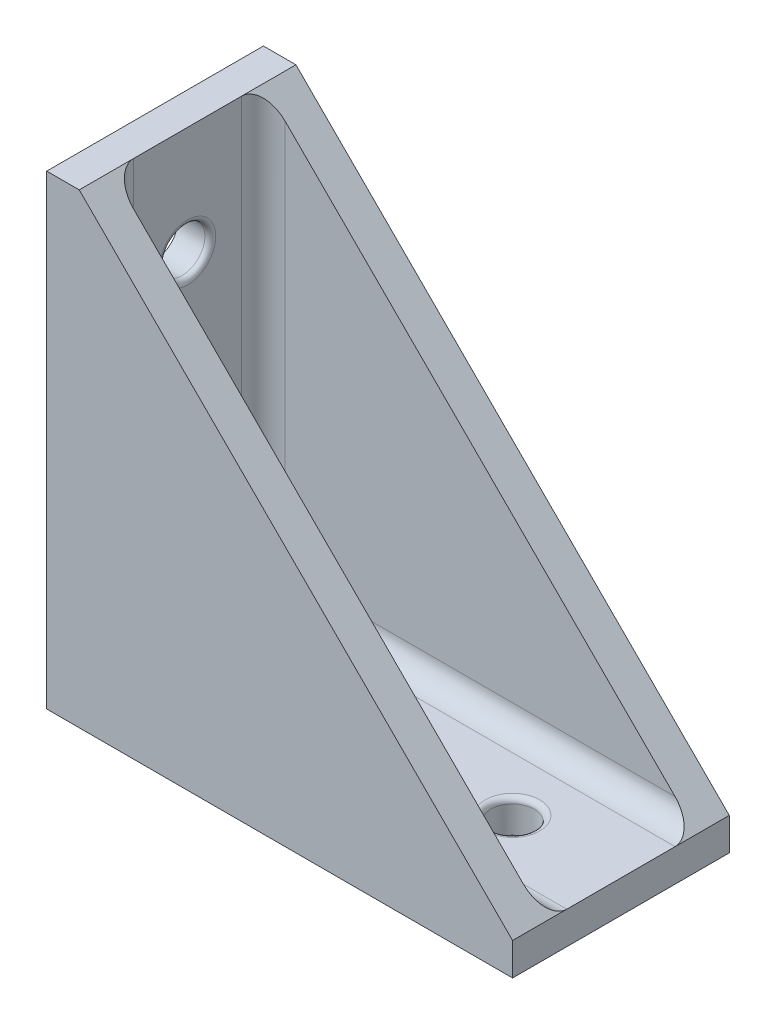
ISO-10303-21;
HEADER;
FILE_DESCRIPTION(('STEP AP214'),'2;1');
FILE_NAME('part.step','',(''),(''),'','','');
FILE_SCHEMA(('AUTOMOTIVE_DESIGN { 1 0 10303 214 1 1 1 1 }'));
ENDSEC;
DATA;
#1=APPLICATION_CONTEXT('core data for automotive mechanical design processes');
#2=APPLICATION_PROTOCOL_DEFINITION('international standard','automotive_design',2000,#1);
#3=PRODUCT_CONTEXT('',#1,'mechanical');
#4=PRODUCT('Part','Part','',(#3));
#5=PRODUCT_RELATED_PRODUCT_CATEGORY('part','',(#4));
#6=PRODUCT_DEFINITION_FORMATION('','',#4);
#7=PRODUCT_DEFINITION_CONTEXT('part definition',#1,'design');
#8=PRODUCT_DEFINITION('design','',#6,#7);
#9=PRODUCT_DEFINITION_SHAPE('','',#8);
#10=(LENGTH_UNIT() NAMED_UNIT(*) SI_UNIT(.MILLI.,.METRE.));
#11=(NAMED_UNIT(*) PLANE_ANGLE_UNIT() SI_UNIT($,.RADIAN.));
#12=(NAMED_UNIT(*) SI_UNIT($,.STERADIAN.) SOLID_ANGLE_UNIT());
#13=UNCERTAINTY_MEASURE_WITH_UNIT(LENGTH_MEASURE(1.E-05),#10,'distance_accuracy_value','');
#14=(GEOMETRIC_REPRESENTATION_CONTEXT(3) GLOBAL_UNCERTAINTY_ASSIGNED_CONTEXT((#13)) GLOBAL_UNIT_ASSIGNED_CONTEXT((#10,
#11,#12)) REPRESENTATION_CONTEXT('',''));
#15=CARTESIAN_POINT('',(0.,0.,0.));
#16=DIRECTION('',(0.,0.,1.));
#17=DIRECTION('',(1.,0.,0.));
#18=AXIS2_PLACEMENT_3D('',#15,#16,#17);
#19=CARTESIAN_POINT('',(3.00000000000001,3.,20.));
#20=DIRECTION('',(0.,-1.,0.));
#21=DIRECTION('',(0.,0.,-1.));
#22=AXIS2_PLACEMENT_3D('',#19,#20,#21);
#23=PLANE('',#22);
#24=CARTESIAN_POINT('',(33.,3.,10.));
#25=DIRECTION('',(0.,-1.,0.));
#26=DIRECTION('',(0.,0.,-1.));
#27=AXIS2_PLACEMENT_3D('',#24,#25,#26);
#28=CIRCLE('',#27,2.5);
#29=CARTESIAN_POINT('',(33.,3.,7.5));
#30=VERTEX_POINT('',#29);
#31=EDGE_CURVE('E213',#30,#30,#28,.T.);
#32=ORIENTED_EDGE('',*,*,#31,.T.);
#33=EDGE_LOOP('',(#32));
#34=FACE_BOUND('',#33,.T.);
#35=CARTESIAN_POINT('',(13.,3.,10.));
#36=DIRECTION('',(0.,-1.,0.));
#37=DIRECTION('',(0.,0.,-1.));
#38=AXIS2_PLACEMENT_3D('',#35,#36,#37);
#39=CIRCLE('',#38,2.5);
#40=CARTESIAN_POINT('',(13.,3.,7.50000000000001));
#41=VERTEX_POINT('',#40);
#42=EDGE_CURVE('E210',#41,#41,#39,.T.);
#43=ORIENTED_EDGE('',*,*,#42,.T.);
#44=EDGE_LOOP('',(#43));
#45=FACE_BOUND('',#44,.T.);
#46=DIRECTION('',(0.,0.,-1.));
#47=VECTOR('',#46,1.);
#48=CARTESIAN_POINT('',(5.00000000000001,3.,17.));
#49=LINE('',#48,#47);
#50=CARTESIAN_POINT('',(5.00000000000001,3.,5.));
#51=VERTEX_POINT('',#50);
#52=CARTESIAN_POINT('',(5.00000000000001,3.,15.));
#53=VERTEX_POINT('',#52);
#54=EDGE_CURVE('E155',#51,#53,#49,.F.);
#55=ORIENTED_EDGE('',*,*,#54,.T.);
#56=DIRECTION('',(1.,0.,0.));
#57=VECTOR('',#56,1.);
#58=CARTESIAN_POINT('',(43.,3.,15.));
#59=LINE('',#58,#57);
#60=CARTESIAN_POINT('',(43.,3.,15.));
#61=VERTEX_POINT('',#60);
#62=EDGE_CURVE('E163',#53,#61,#59,.T.);
#63=ORIENTED_EDGE('',*,*,#62,.T.);
#64=DIRECTION('',(0.,0.,-1.));
#65=VECTOR('',#64,1.);
#66=CARTESIAN_POINT('',(43.,3.,20.));
#67=LINE('',#66,#65);
#68=CARTESIAN_POINT('',(43.,3.,5.));
#69=VERTEX_POINT('',#68);
#70=EDGE_CURVE('E152',#61,#69,#67,.T.);
#71=ORIENTED_EDGE('',*,*,#70,.T.);
#72=DIRECTION('',(-1.,0.,0.));
#73=VECTOR('',#72,1.);
#74=CARTESIAN_POINT('',(3.00000000000001,3.,5.));
#75=LINE('',#74,#73);
#76=EDGE_CURVE('E161',#69,#51,#75,.T.);
#77=ORIENTED_EDGE('',*,*,#76,.T.);
#78=EDGE_LOOP('',(#55,#63,#71,#77));
#79=FACE_BOUND('',#78,.T.);
#80=ADVANCED_FACE('F33',(#34,#45,#79),#23,.F.);
#81=CARTESIAN_POINT('',(3.00000000000001,43.,20.));
#82=DIRECTION('',(-1.,0.,0.));
#83=DIRECTION('',(0.,-1.,0.));
#84=AXIS2_PLACEMENT_3D('',#81,#82,#83);
#85=PLANE('',#84);
#86=CARTESIAN_POINT('',(3.00000000000001,13.,10.));
#87=DIRECTION('',(-1.,0.,0.));
#88=DIRECTION('',(0.,-1.,0.));
#89=AXIS2_PLACEMENT_3D('',#86,#87,#88);
#90=CIRCLE('',#89,2.6);
#91=CARTESIAN_POINT('',(3.00000000000001,10.4,10.));
#92=VERTEX_POINT('',#91);
#93=EDGE_CURVE('E41',#92,#92,#90,.T.);
#94=ORIENTED_EDGE('',*,*,#93,.T.);
#95=EDGE_LOOP('',(#94));
#96=FACE_BOUND('',#95,.T.);
#97=CARTESIAN_POINT('',(3.00000000000001,33.,10.));
#98=DIRECTION('',(-1.,0.,0.));
#99=DIRECTION('',(0.,-1.,0.));
#100=AXIS2_PLACEMENT_3D('',#97,#98,#99);
#101=CIRCLE('',#100,2.6);
#102=CARTESIAN_POINT('',(3.00000000000001,30.4,10.));
#103=VERTEX_POINT('',#102);
#104=EDGE_CURVE('E222',#103,#103,#101,.T.);
#105=ORIENTED_EDGE('',*,*,#104,.T.);
#106=EDGE_LOOP('',(#105));
#107=FACE_BOUND('',#106,.T.);
#108=DIRECTION('',(0.,0.,-1.));
#109=VECTOR('',#108,1.);
#110=CARTESIAN_POINT('',(3.00000000000001,5.,3.));
#111=LINE('',#110,#109);
#112=CARTESIAN_POINT('',(3.00000000000001,5.,15.));
#113=VERTEX_POINT('',#112);
#114=CARTESIAN_POINT('',(3.00000000000001,5.,5.));
#115=VERTEX_POINT('',#114);
#116=EDGE_CURVE('E173',#113,#115,#111,.T.);
#117=ORIENTED_EDGE('',*,*,#116,.T.);
#118=DIRECTION('',(0.,1.,0.));
#119=VECTOR('',#118,1.);
#120=CARTESIAN_POINT('',(3.00000000000001,43.,5.));
#121=LINE('',#120,#119);
#122=CARTESIAN_POINT('',(3.00000000000001,43.,5.));
#123=VERTEX_POINT('',#122);
#124=EDGE_CURVE('E177',#115,#123,#121,.T.);
#125=ORIENTED_EDGE('',*,*,#124,.T.);
#126=DIRECTION('',(0.,0.,-1.));
#127=VECTOR('',#126,1.);
#128=CARTESIAN_POINT('',(3.00000000000001,43.,20.));
#129=LINE('',#128,#127);
#130=CARTESIAN_POINT('',(3.00000000000001,43.,15.));
#131=VERTEX_POINT('',#130);
#132=EDGE_CURVE('E282',#131,#123,#129,.T.);
#133=ORIENTED_EDGE('',*,*,#132,.F.);
#134=DIRECTION('',(0.,-1.,0.));
#135=VECTOR('',#134,1.);
#136=CARTESIAN_POINT('',(3.00000000000001,3.,15.));
#137=LINE('',#136,#135);
#138=EDGE_CURVE('E175',#131,#113,#137,.T.);
#139=ORIENTED_EDGE('',*,*,#138,.T.);
#140=EDGE_LOOP('',(#117,#125,#133,#139));
#141=FACE_BOUND('',#140,.T.);
#142=ADVANCED_FACE('F227',(#96,#107,#141),#85,.F.);
#143=CARTESIAN_POINT('',(0.,0.,20.));
#144=DIRECTION('',(0.,1.,0.));
#145=DIRECTION('',(0.,0.,1.));
#146=AXIS2_PLACEMENT_3D('',#143,#144,#145);
#147=PLANE('',#146);
#148=CARTESIAN_POINT('',(33.,0.,10.));
#149=DIRECTION('',(0.,1.,0.));
#150=DIRECTION('',(0.,0.,1.));
#151=AXIS2_PLACEMENT_3D('',#148,#149,#150);
#152=CIRCLE('',#151,2.);
#153=CARTESIAN_POINT('',(33.,0.,12.));
#154=VERTEX_POINT('',#153);
#155=EDGE_CURVE('E207',#154,#154,#152,.T.);
#156=ORIENTED_EDGE('',*,*,#155,.T.);
#157=EDGE_LOOP('',(#156));
#158=FACE_BOUND('',#157,.T.);
#159=CARTESIAN_POINT('',(13.,0.,10.));
#160=DIRECTION('',(0.,1.,0.));
#161=DIRECTION('',(0.,0.,1.));
#162=AXIS2_PLACEMENT_3D('',#159,#160,#161);
#163=CIRCLE('',#162,2.);
#164=CARTESIAN_POINT('',(13.,0.,12.));
#165=VERTEX_POINT('',#164);
#166=EDGE_CURVE('E247',#165,#165,#163,.T.);
#167=ORIENTED_EDGE('',*,*,#166,.T.);
#168=EDGE_LOOP('',(#167));
#169=FACE_BOUND('',#168,.T.);
#170=DIRECTION('',(1.,0.,0.));
#171=VECTOR('',#170,1.);
#172=CARTESIAN_POINT('',(0.,0.,0.));
#173=LINE('',#172,#171);
#174=CARTESIAN_POINT('',(0.,0.,0.));
#175=VERTEX_POINT('',#174);
#176=CARTESIAN_POINT('',(43.,0.,0.));
#177=VERTEX_POINT('',#176);
#178=EDGE_CURVE('E264',#175,#177,#173,.T.);
#179=ORIENTED_EDGE('',*,*,#178,.T.);
#180=DIRECTION('',(0.,0.,-1.));
#181=VECTOR('',#180,1.);
#182=CARTESIAN_POINT('',(43.,0.,20.));
#183=LINE('',#182,#181);
#184=CARTESIAN_POINT('',(43.,0.,20.));
#185=VERTEX_POINT('',#184);
#186=EDGE_CURVE('E153',#185,#177,#183,.T.);
#187=ORIENTED_EDGE('',*,*,#186,.F.);
#188=DIRECTION('',(1.,0.,0.));
#189=VECTOR('',#188,1.);
#190=CARTESIAN_POINT('',(0.,0.,20.));
#191=LINE('',#190,#189);
#192=CARTESIAN_POINT('',(0.,0.,20.));
#193=VERTEX_POINT('',#192);
#194=EDGE_CURVE('E146',#193,#185,#191,.T.);
#195=ORIENTED_EDGE('',*,*,#194,.F.);
#196=DIRECTION('',(0.,0.,-1.));
#197=VECTOR('',#196,1.);
#198=CARTESIAN_POINT('',(0.,0.,20.));
#199=LINE('',#198,#197);
#200=EDGE_CURVE('E271',#193,#175,#199,.T.);
#201=ORIENTED_EDGE('',*,*,#200,.T.);
#202=EDGE_LOOP('',(#179,#187,#195,#201));
#203=FACE_BOUND('',#202,.T.);
#204=ADVANCED_FACE('F319',(#158,#169,#203),#147,.F.);
#205=CARTESIAN_POINT('',(43.,3.,20.));
#206=DIRECTION('',(-1.,0.,0.));
#207=DIRECTION('',(0.,0.,1.));
#208=AXIS2_PLACEMENT_3D('',#205,#206,#207);
#209=PLANE('',#208);
#210=DIRECTION('',(0.,1.,0.));
#211=VECTOR('',#210,1.);
#212=CARTESIAN_POINT('',(43.,3.,0.));
#213=LINE('',#212,#211);
#214=CARTESIAN_POINT('',(43.,3.,0.));
#215=VERTEX_POINT('',#214);
#216=EDGE_CURVE('E274',#177,#215,#213,.T.);
#217=ORIENTED_EDGE('',*,*,#216,.T.);
#218=DIRECTION('',(0.,0.,-1.));
#219=VECTOR('',#218,1.);
#220=CARTESIAN_POINT('',(43.,3.,3.));
#221=LINE('',#220,#219);
#222=EDGE_CURVE('E57',#69,#215,#221,.T.);
#223=ORIENTED_EDGE('',*,*,#222,.F.);
#224=ORIENTED_EDGE('',*,*,#70,.F.);
#225=CARTESIAN_POINT('',(43.,3.,20.));
#226=VERTEX_POINT('',#225);
#227=EDGE_CURVE('E136',#226,#61,#67,.T.);
#228=ORIENTED_EDGE('',*,*,#227,.F.);
#229=DIRECTION('',(0.,1.,0.));
#230=VECTOR('',#229,1.);
#231=CARTESIAN_POINT('',(43.,3.,20.));
#232=LINE('',#231,#230);
#233=EDGE_CURVE('E143',#185,#226,#232,.T.);
#234=ORIENTED_EDGE('',*,*,#233,.F.);
#235=ORIENTED_EDGE('',*,*,#186,.T.);
#236=EDGE_LOOP('',(#217,#223,#224,#228,#234,#235));
#237=FACE_BOUND('',#236,.T.);
#238=ADVANCED_FACE('F151',(#237),#209,.F.);
#239=CARTESIAN_POINT('',(0.,43.,20.));
#240=DIRECTION('',(0.,-1.,0.));
#241=DIRECTION('',(0.,0.,-1.));
#242=AXIS2_PLACEMENT_3D('',#239,#240,#241);
#243=PLANE('',#242);
#244=DIRECTION('',(-1.,0.,0.));
#245=VECTOR('',#244,1.);
#246=CARTESIAN_POINT('',(0.,43.,0.));
#247=LINE('',#246,#245);
#248=CARTESIAN_POINT('',(3.00000000000001,43.,0.));
#249=VERTEX_POINT('',#248);
#250=CARTESIAN_POINT('',(0.,43.,0.));
#251=VERTEX_POINT('',#250);
#252=EDGE_CURVE('E276',#249,#251,#247,.T.);
#253=ORIENTED_EDGE('',*,*,#252,.T.);
#254=DIRECTION('',(0.,0.,-1.));
#255=VECTOR('',#254,1.);
#256=CARTESIAN_POINT('',(0.,43.,20.));
#257=LINE('',#256,#255);
#258=CARTESIAN_POINT('',(0.,43.,20.));
#259=VERTEX_POINT('',#258);
#260=EDGE_CURVE('E280',#259,#251,#257,.T.);
#261=ORIENTED_EDGE('',*,*,#260,.F.);
#262=DIRECTION('',(-1.,0.,0.));
#263=VECTOR('',#262,1.);
#264=CARTESIAN_POINT('',(0.,43.,20.));
#265=LINE('',#264,#263);
#266=CARTESIAN_POINT('',(3.00000000000001,43.,20.));
#267=VERTEX_POINT('',#266);
#268=EDGE_CURVE('E149',#267,#259,#265,.T.);
#269=ORIENTED_EDGE('',*,*,#268,.F.);
#270=EDGE_CURVE('E48',#267,#131,#129,.T.);
#271=ORIENTED_EDGE('',*,*,#270,.T.);
#272=ORIENTED_EDGE('',*,*,#132,.T.);
#273=DIRECTION('',(0.,0.,-1.));
#274=VECTOR('',#273,1.);
#275=CARTESIAN_POINT('',(3.00000000000001,43.,3.));
#276=LINE('',#275,#274);
#277=EDGE_CURVE('E71',#123,#249,#276,.T.);
#278=ORIENTED_EDGE('',*,*,#277,.T.);
#279=EDGE_LOOP('',(#253,#261,#269,#271,#272,#278));
#280=FACE_BOUND('',#279,.T.);
#281=ADVANCED_FACE('F288',(#280),#243,.F.);
#282=CARTESIAN_POINT('',(0.,0.,20.));
#283=DIRECTION('',(1.,0.,0.));
#284=DIRECTION('',(0.,0.,-1.));
#285=AXIS2_PLACEMENT_3D('',#282,#283,#284);
#286=PLANE('',#285);
#287=CARTESIAN_POINT('',(0.,13.,10.));
#288=DIRECTION('',(1.,0.,0.));
#289=DIRECTION('',(0.,1.,0.));
#290=AXIS2_PLACEMENT_3D('',#287,#288,#289);
#291=CIRCLE('',#290,2.1);
#292=CARTESIAN_POINT('',(0.,15.1,10.));
#293=VERTEX_POINT('',#292);
#294=EDGE_CURVE('E244',#293,#293,#291,.T.);
#295=ORIENTED_EDGE('',*,*,#294,.T.);
#296=EDGE_LOOP('',(#295));
#297=FACE_BOUND('',#296,.T.);
#298=CARTESIAN_POINT('',(0.,33.,10.));
#299=DIRECTION('',(1.,0.,0.));
#300=DIRECTION('',(0.,1.,0.));
#301=AXIS2_PLACEMENT_3D('',#298,#299,#300);
#302=CIRCLE('',#301,2.1);
#303=CARTESIAN_POINT('',(0.,35.1,10.));
#304=VERTEX_POINT('',#303);
#305=EDGE_CURVE('E246',#304,#304,#302,.T.);
#306=ORIENTED_EDGE('',*,*,#305,.T.);
#307=EDGE_LOOP('',(#306));
#308=FACE_BOUND('',#307,.T.);
#309=DIRECTION('',(0.,-1.,0.));
#310=VECTOR('',#309,1.);
#311=CARTESIAN_POINT('',(0.,0.,0.));
#312=LINE('',#311,#310);
#313=EDGE_CURVE('E266',#251,#175,#312,.T.);
#314=ORIENTED_EDGE('',*,*,#313,.T.);
#315=ORIENTED_EDGE('',*,*,#200,.F.);
#316=DIRECTION('',(0.,-1.,0.));
#317=VECTOR('',#316,1.);
#318=CARTESIAN_POINT('',(0.,0.,20.));
#319=LINE('',#318,#317);
#320=EDGE_CURVE('E269',#259,#193,#319,.T.);
#321=ORIENTED_EDGE('',*,*,#320,.F.);
#322=ORIENTED_EDGE('',*,*,#260,.T.);
#323=EDGE_LOOP('',(#314,#315,#321,#322));
#324=FACE_BOUND('',#323,.T.);
#325=ADVANCED_FACE('F317',(#297,#308,#324),#286,.F.);
#326=CARTESIAN_POINT('',(0.,0.,20.));
#327=DIRECTION('',(0.,0.,-1.));
#328=DIRECTION('',(-1.,0.,0.));
#329=AXIS2_PLACEMENT_3D('',#326,#327,#328);
#330=PLANE('',#329);
#331=DIRECTION('',(-0.707106781186548,0.707106781186547,0.));
#332=VECTOR('',#331,1.);
#333=CARTESIAN_POINT('',(3.00000000000001,43.,20.));
#334=LINE('',#333,#332);
#335=EDGE_CURVE('E132',#226,#267,#334,.T.);
#336=ORIENTED_EDGE('',*,*,#335,.T.);
#337=ORIENTED_EDGE('',*,*,#268,.T.);
#338=ORIENTED_EDGE('',*,*,#320,.T.);
#339=ORIENTED_EDGE('',*,*,#194,.T.);
#340=ORIENTED_EDGE('',*,*,#233,.T.);
#341=EDGE_LOOP('',(#336,#337,#338,#339,#340));
#342=FACE_BOUND('',#341,.T.);
#343=ADVANCED_FACE('F144',(#342),#330,.F.);
#344=CARTESIAN_POINT('',(0.,0.,0.));
#345=DIRECTION('',(0.,0.,-1.));
#346=DIRECTION('',(-1.,0.,0.));
#347=AXIS2_PLACEMENT_3D('',#344,#345,#346);
#348=PLANE('',#347);
#349=ORIENTED_EDGE('',*,*,#252,.F.);
#350=DIRECTION('',(0.707106781186548,-0.707106781186547,0.));
#351=VECTOR('',#350,1.);
#352=CARTESIAN_POINT('',(3.00000000000001,43.,0.));
#353=LINE('',#352,#351);
#354=EDGE_CURVE('E250',#249,#215,#353,.T.);
#355=ORIENTED_EDGE('',*,*,#354,.T.);
#356=ORIENTED_EDGE('',*,*,#216,.F.);
#357=ORIENTED_EDGE('',*,*,#178,.F.);
#358=ORIENTED_EDGE('',*,*,#313,.F.);
#359=EDGE_LOOP('',(#349,#355,#356,#357,#358));
#360=FACE_BOUND('',#359,.T.);
#361=ADVANCED_FACE('F314',(#360),#348,.T.);
#362=CARTESIAN_POINT('',(3.00000000000001,43.,17.));
#363=DIRECTION('',(0.707106781186547,0.707106781186548,0.));
#364=DIRECTION('',(-0.707106781186548,0.707106781186547,0.));
#365=AXIS2_PLACEMENT_3D('',#362,#363,#364);
#366=PLANE('',#365);
#367=ORIENTED_EDGE('',*,*,#335,.F.);
#368=ORIENTED_EDGE('',*,*,#227,.T.);
#369=CARTESIAN_POINT('',(41.,5.,15.));
#370=DIRECTION('',(0.707106781186547,0.707106781186548,0.));
#371=DIRECTION('',(-0.707106781186548,0.707106781186547,0.));
#372=AXIS2_PLACEMENT_3D('',#369,#370,#371);
#373=ELLIPSE('',#372,2.82842712474619,2.);
#374=CARTESIAN_POINT('',(41.,5.,17.));
#375=VERTEX_POINT('',#374);
#376=EDGE_CURVE('E179',#61,#375,#373,.F.);
#377=ORIENTED_EDGE('',*,*,#376,.T.);
#378=DIRECTION('',(-0.707106781186548,0.707106781186547,0.));
#379=VECTOR('',#378,1.);
#380=CARTESIAN_POINT('',(3.00000000000001,43.,17.));
#381=LINE('',#380,#379);
#382=CARTESIAN_POINT('',(5.00000000000001,41.,17.));
#383=VERTEX_POINT('',#382);
#384=EDGE_CURVE('E140',#375,#383,#381,.T.);
#385=ORIENTED_EDGE('',*,*,#384,.T.);
#386=CARTESIAN_POINT('',(5.00000000000001,41.,15.));
#387=DIRECTION('',(0.707106781186547,0.707106781186548,0.));
#388=DIRECTION('',(-0.707106781186548,0.707106781186547,0.));
#389=AXIS2_PLACEMENT_3D('',#386,#387,#388);
#390=ELLIPSE('',#389,2.82842712474619,2.);
#391=EDGE_CURVE('E186',#383,#131,#390,.F.);
#392=ORIENTED_EDGE('',*,*,#391,.T.);
#393=ORIENTED_EDGE('',*,*,#270,.F.);
#394=EDGE_LOOP('',(#367,#368,#377,#385,#392,#393));
#395=FACE_BOUND('',#394,.T.);
#396=ADVANCED_FACE('F134',(#395),#366,.T.);
#397=CARTESIAN_POINT('',(0.,0.,17.));
#398=DIRECTION('',(0.,0.,1.));
#399=DIRECTION('',(1.,0.,0.));
#400=AXIS2_PLACEMENT_3D('',#397,#398,#399);
#401=PLANE('',#400);
#402=ORIENTED_EDGE('',*,*,#384,.F.);
#403=DIRECTION('',(1.,0.,0.));
#404=VECTOR('',#403,1.);
#405=CARTESIAN_POINT('',(3.00000000000001,5.,17.));
#406=LINE('',#405,#404);
#407=CARTESIAN_POINT('',(5.00000000000001,5.,17.));
#408=VERTEX_POINT('',#407);
#409=EDGE_CURVE('E168',#375,#408,#406,.F.);
#410=ORIENTED_EDGE('',*,*,#409,.T.);
#411=DIRECTION('',(0.,-1.,0.));
#412=VECTOR('',#411,1.);
#413=CARTESIAN_POINT('',(5.00000000000001,43.,17.));
#414=LINE('',#413,#412);
#415=EDGE_CURVE('E166',#408,#383,#414,.F.);
#416=ORIENTED_EDGE('',*,*,#415,.T.);
#417=EDGE_LOOP('',(#402,#410,#416));
#418=FACE_BOUND('',#417,.T.);
#419=ADVANCED_FACE('F349',(#418),#401,.F.);
#420=CARTESIAN_POINT('',(3.00000000000001,43.,3.));
#421=DIRECTION('',(0.707106781186547,0.707106781186548,0.));
#422=DIRECTION('',(-0.707106781186548,0.707106781186547,0.));
#423=AXIS2_PLACEMENT_3D('',#420,#421,#422);
#424=PLANE('',#423);
#425=ORIENTED_EDGE('',*,*,#354,.F.);
#426=ORIENTED_EDGE('',*,*,#277,.F.);
#427=CARTESIAN_POINT('',(5.00000000000001,41.,5.));
#428=DIRECTION('',(0.707106781186547,0.707106781186548,0.));
#429=DIRECTION('',(-0.707106781186548,0.707106781186547,0.));
#430=AXIS2_PLACEMENT_3D('',#427,#428,#429);
#431=ELLIPSE('',#430,2.82842712474619,2.);
#432=CARTESIAN_POINT('',(5.00000000000001,41.,3.));
#433=VERTEX_POINT('',#432);
#434=EDGE_CURVE('E184',#123,#433,#431,.F.);
#435=ORIENTED_EDGE('',*,*,#434,.T.);
#436=DIRECTION('',(0.707106781186548,-0.707106781186547,0.));
#437=VECTOR('',#436,1.);
#438=CARTESIAN_POINT('',(3.00000000000001,43.,3.));
#439=LINE('',#438,#437);
#440=CARTESIAN_POINT('',(41.,5.,3.));
#441=VERTEX_POINT('',#440);
#442=EDGE_CURVE('E256',#433,#441,#439,.T.);
#443=ORIENTED_EDGE('',*,*,#442,.T.);
#444=CARTESIAN_POINT('',(41.,5.,5.));
#445=DIRECTION('',(0.707106781186547,0.707106781186548,0.));
#446=DIRECTION('',(-0.707106781186548,0.707106781186547,0.));
#447=AXIS2_PLACEMENT_3D('',#444,#445,#446);
#448=ELLIPSE('',#447,2.82842712474619,2.);
#449=EDGE_CURVE('E181',#441,#69,#448,.F.);
#450=ORIENTED_EDGE('',*,*,#449,.T.);
#451=ORIENTED_EDGE('',*,*,#222,.T.);
#452=EDGE_LOOP('',(#425,#426,#435,#443,#450,#451));
#453=FACE_BOUND('',#452,.T.);
#454=ADVANCED_FACE('F295',(#453),#424,.T.);
#455=CARTESIAN_POINT('',(0.,0.,3.));
#456=DIRECTION('',(0.,0.,1.));
#457=DIRECTION('',(1.,0.,0.));
#458=AXIS2_PLACEMENT_3D('',#455,#456,#457);
#459=PLANE('',#458);
#460=DIRECTION('',(0.,1.,0.));
#461=VECTOR('',#460,1.);
#462=CARTESIAN_POINT('',(5.00000000000001,0.,3.));
#463=LINE('',#462,#461);
#464=CARTESIAN_POINT('',(5.00000000000001,5.,3.));
#465=VERTEX_POINT('',#464);
#466=EDGE_CURVE('E82',#433,#465,#463,.F.);
#467=ORIENTED_EDGE('',*,*,#466,.T.);
#468=DIRECTION('',(-1.,0.,0.));
#469=VECTOR('',#468,1.);
#470=CARTESIAN_POINT('',(0.,5.,3.));
#471=LINE('',#470,#469);
#472=EDGE_CURVE('E171',#465,#441,#471,.F.);
#473=ORIENTED_EDGE('',*,*,#472,.T.);
#474=ORIENTED_EDGE('',*,*,#442,.F.);
#475=EDGE_LOOP('',(#467,#473,#474));
#476=FACE_BOUND('',#475,.T.);
#477=ADVANCED_FACE('F297',(#476),#459,.T.);
#478=CARTESIAN_POINT('',(0.,33.,10.));
#479=DIRECTION('',(1.,0.,0.));
#480=DIRECTION('',(0.,1.,0.));
#481=AXIS2_PLACEMENT_3D('',#478,#479,#480);
#482=CYLINDRICAL_SURFACE('',#481,2.1);
#483=CARTESIAN_POINT('',(2.50000000000001,33.,10.));
#484=DIRECTION('',(-1.,0.,0.));
#485=DIRECTION('',(0.,-1.,0.));
#486=AXIS2_PLACEMENT_3D('',#483,#484,#485);
#487=CIRCLE('',#486,2.1);
#488=CARTESIAN_POINT('',(2.50000000000001,30.9,10.));
#489=VERTEX_POINT('',#488);
#490=EDGE_CURVE('E11',#489,#489,#487,.F.);
#491=ORIENTED_EDGE('',*,*,#490,.T.);
#492=EDGE_LOOP('',(#491));
#493=FACE_BOUND('',#492,.T.);
#494=ORIENTED_EDGE('',*,*,#305,.F.);
#495=EDGE_LOOP('',(#494));
#496=FACE_BOUND('',#495,.T.);
#497=ADVANCED_FACE('F240',(#493,#496),#482,.F.);
#498=CARTESIAN_POINT('',(0.,13.,10.));
#499=DIRECTION('',(1.,0.,0.));
#500=DIRECTION('',(0.,1.,0.));
#501=AXIS2_PLACEMENT_3D('',#498,#499,#500);
#502=CYLINDRICAL_SURFACE('',#501,2.1);
#503=CARTESIAN_POINT('',(2.50000000000001,13.,10.));
#504=DIRECTION('',(-1.,0.,0.));
#505=DIRECTION('',(0.,-1.,0.));
#506=AXIS2_PLACEMENT_3D('',#503,#504,#505);
#507=CIRCLE('',#506,2.1);
#508=CARTESIAN_POINT('',(2.50000000000001,10.9,10.));
#509=VERTEX_POINT('',#508);
#510=EDGE_CURVE('E219',#509,#509,#507,.F.);
#511=ORIENTED_EDGE('',*,*,#510,.T.);
#512=EDGE_LOOP('',(#511));
#513=FACE_BOUND('',#512,.T.);
#514=ORIENTED_EDGE('',*,*,#294,.F.);
#515=EDGE_LOOP('',(#514));
#516=FACE_BOUND('',#515,.T.);
#517=ADVANCED_FACE('F236',(#513,#516),#502,.F.);
#518=CARTESIAN_POINT('',(13.,0.,10.));
#519=DIRECTION('',(0.,1.,0.));
#520=DIRECTION('',(0.,0.,1.));
#521=AXIS2_PLACEMENT_3D('',#518,#519,#520);
#522=CYLINDRICAL_SURFACE('',#521,2.);
#523=CARTESIAN_POINT('',(13.,2.5,10.));
#524=DIRECTION('',(0.,-1.,0.));
#525=DIRECTION('',(0.,0.,-1.));
#526=AXIS2_PLACEMENT_3D('',#523,#524,#525);
#527=CIRCLE('',#526,2.);
#528=CARTESIAN_POINT('',(13.,2.5,8.00000000000001));
#529=VERTEX_POINT('',#528);
#530=EDGE_CURVE('E216',#529,#529,#527,.F.);
#531=ORIENTED_EDGE('',*,*,#530,.T.);
#532=EDGE_LOOP('',(#531));
#533=FACE_BOUND('',#532,.T.);
#534=ORIENTED_EDGE('',*,*,#166,.F.);
#535=EDGE_LOOP('',(#534));
#536=FACE_BOUND('',#535,.T.);
#537=ADVANCED_FACE('F239',(#533,#536),#522,.F.);
#538=CARTESIAN_POINT('',(33.,0.,10.));
#539=DIRECTION('',(0.,1.,0.));
#540=DIRECTION('',(0.,0.,1.));
#541=AXIS2_PLACEMENT_3D('',#538,#539,#540);
#542=CYLINDRICAL_SURFACE('',#541,2.);
#543=CARTESIAN_POINT('',(33.,2.5,10.));
#544=DIRECTION('',(0.,-1.,0.));
#545=DIRECTION('',(0.,0.,-1.));
#546=AXIS2_PLACEMENT_3D('',#543,#544,#545);
#547=CIRCLE('',#546,2.);
#548=CARTESIAN_POINT('',(33.,2.5,8.));
#549=VERTEX_POINT('',#548);
#550=EDGE_CURVE('E188',#549,#549,#547,.F.);
#551=ORIENTED_EDGE('',*,*,#550,.T.);
#552=EDGE_LOOP('',(#551));
#553=FACE_BOUND('',#552,.T.);
#554=ORIENTED_EDGE('',*,*,#155,.F.);
#555=EDGE_LOOP('',(#554));
#556=FACE_BOUND('',#555,.T.);
#557=ADVANCED_FACE('F362',(#553,#556),#542,.F.);
#558=CARTESIAN_POINT('',(5.00000000000001,43.,5.));
#559=DIRECTION('',(0.,1.,0.));
#560=DIRECTION('',(-1.,0.,0.));
#561=AXIS2_PLACEMENT_3D('',#558,#559,#560);
#562=CYLINDRICAL_SURFACE('',#561,2.);
#563=ORIENTED_EDGE('',*,*,#434,.F.);
#564=ORIENTED_EDGE('',*,*,#124,.F.);
#565=CARTESIAN_POINT('',(5.00000000000001,5.,5.));
#566=DIRECTION('',(0.,1.,0.));
#567=DIRECTION('',(-1.,0.,0.));
#568=AXIS2_PLACEMENT_3D('',#565,#566,#567);
#569=CIRCLE('',#568,2.);
#570=EDGE_CURVE('E204',#465,#115,#569,.T.);
#571=ORIENTED_EDGE('',*,*,#570,.F.);
#572=ORIENTED_EDGE('',*,*,#466,.F.);
#573=EDGE_LOOP('',(#563,#564,#571,#572));
#574=FACE_BOUND('',#573,.T.);
#575=ADVANCED_FACE('F293',(#574),#562,.F.);
#576=CARTESIAN_POINT('',(3.00000000000001,5.,5.));
#577=DIRECTION('',(-1.,0.,0.));
#578=DIRECTION('',(0.,0.,1.));
#579=AXIS2_PLACEMENT_3D('',#576,#577,#578);
#580=CYLINDRICAL_SURFACE('',#579,2.);
#581=ORIENTED_EDGE('',*,*,#449,.F.);
#582=ORIENTED_EDGE('',*,*,#472,.F.);
#583=CARTESIAN_POINT('',(5.00000000000001,5.,5.));
#584=DIRECTION('',(1.,0.,0.));
#585=DIRECTION('',(0.,0.,-1.));
#586=AXIS2_PLACEMENT_3D('',#583,#584,#585);
#587=CIRCLE('',#586,2.);
#588=EDGE_CURVE('E201',#51,#465,#587,.T.);
#589=ORIENTED_EDGE('',*,*,#588,.F.);
#590=ORIENTED_EDGE('',*,*,#76,.F.);
#591=EDGE_LOOP('',(#581,#582,#589,#590));
#592=FACE_BOUND('',#591,.T.);
#593=ADVANCED_FACE('F300',(#592),#580,.F.);
#594=CARTESIAN_POINT('',(5.00000000000001,5.,5.));
#595=DIRECTION('',(0.,0.,1.));
#596=DIRECTION('',(1.,0.,0.));
#597=AXIS2_PLACEMENT_3D('',#594,#595,#596);
#598=SPHERICAL_SURFACE('',#597,2.);
#599=ORIENTED_EDGE('',*,*,#588,.T.);
#600=ORIENTED_EDGE('',*,*,#570,.T.);
#601=CARTESIAN_POINT('',(5.00000000000001,5.,5.));
#602=DIRECTION('',(0.,0.,1.));
#603=DIRECTION('',(1.,0.,0.));
#604=AXIS2_PLACEMENT_3D('',#601,#602,#603);
#605=CIRCLE('',#604,2.);
#606=EDGE_CURVE('E198',#51,#115,#605,.F.);
#607=ORIENTED_EDGE('',*,*,#606,.F.);
#608=EDGE_LOOP('',(#599,#600,#607));
#609=FACE_BOUND('',#608,.T.);
#610=ADVANCED_FACE('F304',(#609),#598,.F.);
#611=CARTESIAN_POINT('',(5.00000000000001,43.,15.));
#612=DIRECTION('',(0.,1.,0.));
#613=DIRECTION('',(-1.,0.,0.));
#614=AXIS2_PLACEMENT_3D('',#611,#612,#613);
#615=CYLINDRICAL_SURFACE('',#614,2.);
#616=ORIENTED_EDGE('',*,*,#391,.F.);
#617=ORIENTED_EDGE('',*,*,#415,.F.);
#618=CARTESIAN_POINT('',(5.00000000000001,5.,15.));
#619=DIRECTION('',(0.,1.,0.));
#620=DIRECTION('',(0.,0.,1.));
#621=AXIS2_PLACEMENT_3D('',#618,#619,#620);
#622=CIRCLE('',#621,2.);
#623=EDGE_CURVE('E195',#113,#408,#622,.T.);
#624=ORIENTED_EDGE('',*,*,#623,.F.);
#625=ORIENTED_EDGE('',*,*,#138,.F.);
#626=EDGE_LOOP('',(#616,#617,#624,#625));
#627=FACE_BOUND('',#626,.T.);
#628=ADVANCED_FACE('F393',(#627),#615,.F.);
#629=CARTESIAN_POINT('',(5.00000000000001,5.,20.));
#630=DIRECTION('',(0.,0.,1.));
#631=DIRECTION('',(1.,0.,0.));
#632=AXIS2_PLACEMENT_3D('',#629,#630,#631);
#633=CYLINDRICAL_SURFACE('',#632,2.);
#634=ORIENTED_EDGE('',*,*,#606,.T.);
#635=ORIENTED_EDGE('',*,*,#116,.F.);
#636=CARTESIAN_POINT('',(5.00000000000001,5.,15.));
#637=DIRECTION('',(0.,0.,-1.));
#638=DIRECTION('',(-1.,0.,0.));
#639=AXIS2_PLACEMENT_3D('',#636,#637,#638);
#640=CIRCLE('',#639,2.);
#641=EDGE_CURVE('E192',#53,#113,#640,.T.);
#642=ORIENTED_EDGE('',*,*,#641,.F.);
#643=ORIENTED_EDGE('',*,*,#54,.F.);
#644=EDGE_LOOP('',(#634,#635,#642,#643));
#645=FACE_BOUND('',#644,.T.);
#646=ADVANCED_FACE('F309',(#645),#633,.F.);
#647=CARTESIAN_POINT('',(5.00000000000001,5.,15.));
#648=DIRECTION('',(0.,0.,1.));
#649=DIRECTION('',(1.,0.,0.));
#650=AXIS2_PLACEMENT_3D('',#647,#648,#649);
#651=SPHERICAL_SURFACE('',#650,2.);
#652=ORIENTED_EDGE('',*,*,#641,.T.);
#653=ORIENTED_EDGE('',*,*,#623,.T.);
#654=CARTESIAN_POINT('',(5.00000000000001,5.,15.));
#655=DIRECTION('',(1.,0.,0.));
#656=DIRECTION('',(0.,0.,-1.));
#657=AXIS2_PLACEMENT_3D('',#654,#655,#656);
#658=CIRCLE('',#657,2.);
#659=EDGE_CURVE('E189',#53,#408,#658,.F.);
#660=ORIENTED_EDGE('',*,*,#659,.F.);
#661=EDGE_LOOP('',(#652,#653,#660));
#662=FACE_BOUND('',#661,.T.);
#663=ADVANCED_FACE('F385',(#662),#651,.F.);
#664=CARTESIAN_POINT('',(3.00000000000001,5.,15.));
#665=DIRECTION('',(-1.,0.,0.));
#666=DIRECTION('',(0.,0.,1.));
#667=AXIS2_PLACEMENT_3D('',#664,#665,#666);
#668=CYLINDRICAL_SURFACE('',#667,2.);
#669=ORIENTED_EDGE('',*,*,#659,.T.);
#670=ORIENTED_EDGE('',*,*,#409,.F.);
#671=ORIENTED_EDGE('',*,*,#376,.F.);
#672=ORIENTED_EDGE('',*,*,#62,.F.);
#673=EDGE_LOOP('',(#669,#670,#671,#672));
#674=FACE_BOUND('',#673,.T.);
#675=ADVANCED_FACE('F376',(#674),#668,.F.);
#676=CARTESIAN_POINT('',(33.,2.5,10.));
#677=DIRECTION('',(0.,-1.,0.));
#678=DIRECTION('',(0.,0.,-1.));
#679=AXIS2_PLACEMENT_3D('',#676,#677,#678);
#680=TOROIDAL_SURFACE('',#679,2.5,0.5);
#681=ORIENTED_EDGE('',*,*,#31,.F.);
#682=EDGE_LOOP('',(#681));
#683=FACE_BOUND('',#682,.T.);
#684=ORIENTED_EDGE('',*,*,#550,.F.);
#685=EDGE_LOOP('',(#684));
#686=FACE_BOUND('',#685,.T.);
#687=ADVANCED_FACE('F374',(#683,#686),#680,.T.);
#688=CARTESIAN_POINT('',(13.,2.5,10.));
#689=DIRECTION('',(0.,-1.,0.));
#690=DIRECTION('',(0.,0.,-1.));
#691=AXIS2_PLACEMENT_3D('',#688,#689,#690);
#692=TOROIDAL_SURFACE('',#691,2.5,0.5);
#693=ORIENTED_EDGE('',*,*,#42,.F.);
#694=EDGE_LOOP('',(#693));
#695=FACE_BOUND('',#694,.T.);
#696=ORIENTED_EDGE('',*,*,#530,.F.);
#697=EDGE_LOOP('',(#696));
#698=FACE_BOUND('',#697,.T.);
#699=ADVANCED_FACE('F233',(#695,#698),#692,.T.);
#700=CARTESIAN_POINT('',(2.50000000000001,13.,10.));
#701=DIRECTION('',(-1.,0.,0.));
#702=DIRECTION('',(0.,-1.,0.));
#703=AXIS2_PLACEMENT_3D('',#700,#701,#702);
#704=TOROIDAL_SURFACE('',#703,2.6,0.5);
#705=ORIENTED_EDGE('',*,*,#93,.F.);
#706=EDGE_LOOP('',(#705));
#707=FACE_BOUND('',#706,.T.);
#708=ORIENTED_EDGE('',*,*,#510,.F.);
#709=EDGE_LOOP('',(#708));
#710=FACE_BOUND('',#709,.T.);
#711=ADVANCED_FACE('F230',(#707,#710),#704,.T.);
#712=CARTESIAN_POINT('',(2.50000000000001,33.,10.));
#713=DIRECTION('',(-1.,0.,0.));
#714=DIRECTION('',(0.,-1.,0.));
#715=AXIS2_PLACEMENT_3D('',#712,#713,#714);
#716=TOROIDAL_SURFACE('',#715,2.6,0.5);
#717=ORIENTED_EDGE('',*,*,#104,.F.);
#718=EDGE_LOOP('',(#717));
#719=FACE_BOUND('',#718,.T.);
#720=ORIENTED_EDGE('',*,*,#490,.F.);
#721=EDGE_LOOP('',(#720));
#722=FACE_BOUND('',#721,.T.);
#723=ADVANCED_FACE('F35',(#719,#722),#716,.T.);
#724=CLOSED_SHELL('',(#80,#142,#204,#238,#281,#325,#343,#361,#396,#419,#454,#477,#497,#517,#537,
#557,#575,#593,#610,#628,#646,#663,#675,#687,#699,#711,#723));
#725=MANIFOLD_SOLID_BREP('B2',#724);
#726=ADVANCED_BREP_SHAPE_REPRESENTATION('',(#18,#725),#14);
#727=SHAPE_DEFINITION_REPRESENTATION(#9,#726);
ENDSEC;
END-ISO-10303-21;
